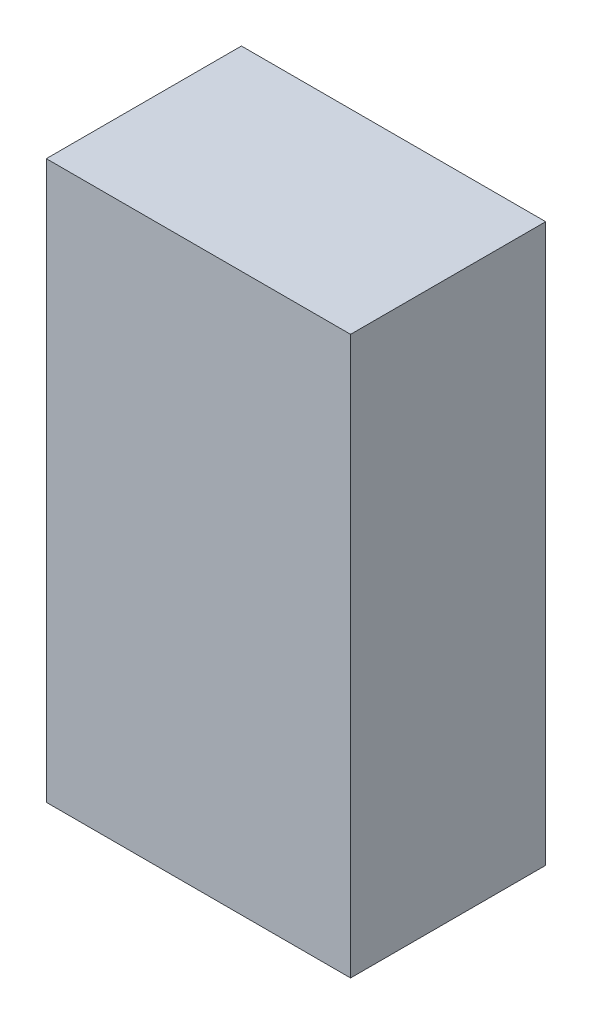
ISO-10303-21;
HEADER;
FILE_DESCRIPTION(('STEP AP214'),'2;1');
FILE_NAME('part.step','',(''),(''),'','','');
FILE_SCHEMA(('AUTOMOTIVE_DESIGN { 1 0 10303 214 1 1 1 1 }'));
ENDSEC;
DATA;
#1=APPLICATION_CONTEXT('core data for automotive mechanical design processes');
#2=APPLICATION_PROTOCOL_DEFINITION('international standard','automotive_design',2000,#1);
#3=PRODUCT_CONTEXT('',#1,'mechanical');
#4=PRODUCT('Part','Part','',(#3));
#5=PRODUCT_RELATED_PRODUCT_CATEGORY('part','',(#4));
#6=PRODUCT_DEFINITION_FORMATION('','',#4);
#7=PRODUCT_DEFINITION_CONTEXT('part definition',#1,'design');
#8=PRODUCT_DEFINITION('design','',#6,#7);
#9=PRODUCT_DEFINITION_SHAPE('','',#8);
#10=(LENGTH_UNIT() NAMED_UNIT(*) SI_UNIT(.MILLI.,.METRE.));
#11=(NAMED_UNIT(*) PLANE_ANGLE_UNIT() SI_UNIT($,.RADIAN.));
#12=(NAMED_UNIT(*) SI_UNIT($,.STERADIAN.) SOLID_ANGLE_UNIT());
#13=UNCERTAINTY_MEASURE_WITH_UNIT(LENGTH_MEASURE(1.E-05),#10,'distance_accuracy_value','');
#14=(GEOMETRIC_REPRESENTATION_CONTEXT(3) GLOBAL_UNCERTAINTY_ASSIGNED_CONTEXT((#13)) GLOBAL_UNIT_ASSIGNED_CONTEXT((#10,
#11,#12)) REPRESENTATION_CONTEXT('',''));
#15=CARTESIAN_POINT('',(0.,0.,0.));
#16=DIRECTION('',(0.,0.,1.));
#17=DIRECTION('',(1.,0.,0.));
#18=AXIS2_PLACEMENT_3D('',#15,#16,#17);
#19=CARTESIAN_POINT('',(13.1,48.,8.4));
#20=DIRECTION('',(-1.,0.,0.));
#21=DIRECTION('',(0.,0.,1.));
#22=AXIS2_PLACEMENT_3D('',#19,#20,#21);
#23=PLANE('',#22);
#24=DIRECTION('',(0.,0.,-1.));
#25=VECTOR('',#24,1.);
#26=CARTESIAN_POINT('',(13.1,0.,8.4));
#27=LINE('',#26,#25);
#28=CARTESIAN_POINT('',(13.1,0.,8.4));
#29=VERTEX_POINT('',#28);
#30=CARTESIAN_POINT('',(13.1,0.,-8.4));
#31=VERTEX_POINT('',#30);
#32=EDGE_CURVE('E109',#29,#31,#27,.T.);
#33=ORIENTED_EDGE('',*,*,#32,.T.);
#34=DIRECTION('',(0.,-1.,0.));
#35=VECTOR('',#34,1.);
#36=CARTESIAN_POINT('',(13.1,48.,-8.4));
#37=LINE('',#36,#35);
#38=CARTESIAN_POINT('',(13.1,48.,-8.4));
#39=VERTEX_POINT('',#38);
#40=EDGE_CURVE('E11',#39,#31,#37,.T.);
#41=ORIENTED_EDGE('',*,*,#40,.F.);
#42=DIRECTION('',(0.,0.,-1.));
#43=VECTOR('',#42,1.);
#44=CARTESIAN_POINT('',(13.1,48.,8.4));
#45=LINE('',#44,#43);
#46=CARTESIAN_POINT('',(13.1,48.,8.4));
#47=VERTEX_POINT('',#46);
#48=EDGE_CURVE('E93',#47,#39,#45,.T.);
#49=ORIENTED_EDGE('',*,*,#48,.F.);
#50=DIRECTION('',(0.,-1.,0.));
#51=VECTOR('',#50,1.);
#52=CARTESIAN_POINT('',(13.1,48.,8.4));
#53=LINE('',#52,#51);
#54=EDGE_CURVE('E105',#47,#29,#53,.T.);
#55=ORIENTED_EDGE('',*,*,#54,.T.);
#56=EDGE_LOOP('',(#33,#41,#49,#55));
#57=FACE_BOUND('',#56,.T.);
#58=ADVANCED_FACE('F41',(#57),#23,.F.);
#59=CARTESIAN_POINT('',(-13.1,48.,-8.4));
#60=DIRECTION('',(0.,0.,1.));
#61=DIRECTION('',(1.,0.,0.));
#62=AXIS2_PLACEMENT_3D('',#59,#60,#61);
#63=PLANE('',#62);
#64=DIRECTION('',(-1.,0.,0.));
#65=VECTOR('',#64,1.);
#66=CARTESIAN_POINT('',(-13.1,0.,-8.4));
#67=LINE('',#66,#65);
#68=CARTESIAN_POINT('',(-13.1,0.,-8.4));
#69=VERTEX_POINT('',#68);
#70=EDGE_CURVE('E98',#31,#69,#67,.T.);
#71=ORIENTED_EDGE('',*,*,#70,.T.);
#72=DIRECTION('',(0.,-1.,0.));
#73=VECTOR('',#72,1.);
#74=CARTESIAN_POINT('',(-13.1,48.,-8.4));
#75=LINE('',#74,#73);
#76=CARTESIAN_POINT('',(-13.1,48.,-8.4));
#77=VERTEX_POINT('',#76);
#78=EDGE_CURVE('E50',#77,#69,#75,.T.);
#79=ORIENTED_EDGE('',*,*,#78,.F.);
#80=DIRECTION('',(-1.,0.,0.));
#81=VECTOR('',#80,1.);
#82=CARTESIAN_POINT('',(-13.1,48.,-8.4));
#83=LINE('',#82,#81);
#84=EDGE_CURVE('E88',#39,#77,#83,.T.);
#85=ORIENTED_EDGE('',*,*,#84,.F.);
#86=ORIENTED_EDGE('',*,*,#40,.T.);
#87=EDGE_LOOP('',(#71,#79,#85,#86));
#88=FACE_BOUND('',#87,.T.);
#89=ADVANCED_FACE('F97',(#88),#63,.F.);
#90=CARTESIAN_POINT('',(-13.1,48.,8.4));
#91=DIRECTION('',(1.,0.,0.));
#92=DIRECTION('',(0.,0.,-1.));
#93=AXIS2_PLACEMENT_3D('',#90,#91,#92);
#94=PLANE('',#93);
#95=DIRECTION('',(0.,0.,1.));
#96=VECTOR('',#95,1.);
#97=CARTESIAN_POINT('',(-13.1,0.,8.4));
#98=LINE('',#97,#96);
#99=CARTESIAN_POINT('',(-13.1,0.,8.4));
#100=VERTEX_POINT('',#99);
#101=EDGE_CURVE('E75',#69,#100,#98,.T.);
#102=ORIENTED_EDGE('',*,*,#101,.T.);
#103=DIRECTION('',(0.,-1.,0.));
#104=VECTOR('',#103,1.);
#105=CARTESIAN_POINT('',(-13.1,48.,8.4));
#106=LINE('',#105,#104);
#107=CARTESIAN_POINT('',(-13.1,48.,8.4));
#108=VERTEX_POINT('',#107);
#109=EDGE_CURVE('E100',#108,#100,#106,.T.);
#110=ORIENTED_EDGE('',*,*,#109,.F.);
#111=DIRECTION('',(0.,0.,1.));
#112=VECTOR('',#111,1.);
#113=CARTESIAN_POINT('',(-13.1,48.,8.4));
#114=LINE('',#113,#112);
#115=EDGE_CURVE('E91',#77,#108,#114,.T.);
#116=ORIENTED_EDGE('',*,*,#115,.F.);
#117=ORIENTED_EDGE('',*,*,#78,.T.);
#118=EDGE_LOOP('',(#102,#110,#116,#117));
#119=FACE_BOUND('',#118,.T.);
#120=ADVANCED_FACE('F101',(#119),#94,.F.);
#121=CARTESIAN_POINT('',(-13.1,48.,8.4));
#122=DIRECTION('',(0.,0.,-1.));
#123=DIRECTION('',(-1.,0.,0.));
#124=AXIS2_PLACEMENT_3D('',#121,#122,#123);
#125=PLANE('',#124);
#126=DIRECTION('',(1.,0.,0.));
#127=VECTOR('',#126,1.);
#128=CARTESIAN_POINT('',(-13.1,0.,8.4));
#129=LINE('',#128,#127);
#130=EDGE_CURVE('E81',#100,#29,#129,.T.);
#131=ORIENTED_EDGE('',*,*,#130,.T.);
#132=ORIENTED_EDGE('',*,*,#54,.F.);
#133=DIRECTION('',(1.,0.,0.));
#134=VECTOR('',#133,1.);
#135=CARTESIAN_POINT('',(-13.1,48.,8.4));
#136=LINE('',#135,#134);
#137=EDGE_CURVE('E58',#108,#47,#136,.T.);
#138=ORIENTED_EDGE('',*,*,#137,.F.);
#139=ORIENTED_EDGE('',*,*,#109,.T.);
#140=EDGE_LOOP('',(#131,#132,#138,#139));
#141=FACE_BOUND('',#140,.T.);
#142=ADVANCED_FACE('F122',(#141),#125,.F.);
#143=CARTESIAN_POINT('',(0.,48.,0.));
#144=DIRECTION('',(0.,-1.,0.));
#145=DIRECTION('',(0.,0.,-1.));
#146=AXIS2_PLACEMENT_3D('',#143,#144,#145);
#147=PLANE('',#146);
#148=ORIENTED_EDGE('',*,*,#48,.T.);
#149=ORIENTED_EDGE('',*,*,#84,.T.);
#150=ORIENTED_EDGE('',*,*,#115,.T.);
#151=ORIENTED_EDGE('',*,*,#137,.T.);
#152=EDGE_LOOP('',(#148,#149,#150,#151));
#153=FACE_BOUND('',#152,.T.);
#154=ADVANCED_FACE('F89',(#153),#147,.F.);
#155=CARTESIAN_POINT('',(0.,0.,0.));
#156=DIRECTION('',(0.,-1.,0.));
#157=DIRECTION('',(0.,0.,-1.));
#158=AXIS2_PLACEMENT_3D('',#155,#156,#157);
#159=PLANE('',#158);
#160=ORIENTED_EDGE('',*,*,#32,.F.);
#161=ORIENTED_EDGE('',*,*,#130,.F.);
#162=ORIENTED_EDGE('',*,*,#101,.F.);
#163=ORIENTED_EDGE('',*,*,#70,.F.);
#164=EDGE_LOOP('',(#160,#161,#162,#163));
#165=FACE_BOUND('',#164,.T.);
#166=ADVANCED_FACE('F125',(#165),#159,.T.);
#167=CLOSED_SHELL('',(#58,#89,#120,#142,#154,#166));
#168=MANIFOLD_SOLID_BREP('B2',#167);
#169=ADVANCED_BREP_SHAPE_REPRESENTATION('',(#18,#168),#14);
#170=SHAPE_DEFINITION_REPRESENTATION(#9,#169);
ENDSEC;
END-ISO-10303-21;
